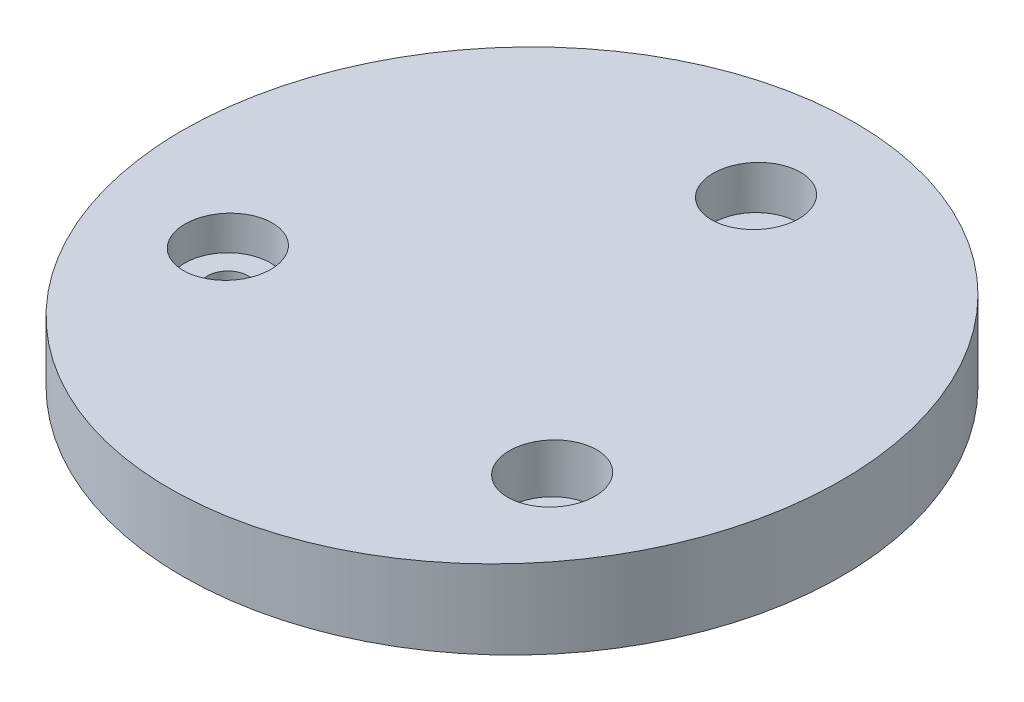
ISO-10303-21;
HEADER;
FILE_DESCRIPTION(('STEP AP214'),'2;1');
FILE_NAME('part.step','',(''),(''),'','','');
FILE_SCHEMA(('AUTOMOTIVE_DESIGN { 1 0 10303 214 1 1 1 1 }'));
ENDSEC;
DATA;
#1=APPLICATION_CONTEXT('core data for automotive mechanical design processes');
#2=APPLICATION_PROTOCOL_DEFINITION('international standard','automotive_design',2000,#1);
#3=PRODUCT_CONTEXT('',#1,'mechanical');
#4=PRODUCT('Part','Part','',(#3));
#5=PRODUCT_RELATED_PRODUCT_CATEGORY('part','',(#4));
#6=PRODUCT_DEFINITION_FORMATION('','',#4);
#7=PRODUCT_DEFINITION_CONTEXT('part definition',#1,'design');
#8=PRODUCT_DEFINITION('design','',#6,#7);
#9=PRODUCT_DEFINITION_SHAPE('','',#8);
#10=(LENGTH_UNIT() NAMED_UNIT(*) SI_UNIT(.MILLI.,.METRE.));
#11=(NAMED_UNIT(*) PLANE_ANGLE_UNIT() SI_UNIT($,.RADIAN.));
#12=(NAMED_UNIT(*) SI_UNIT($,.STERADIAN.) SOLID_ANGLE_UNIT());
#13=UNCERTAINTY_MEASURE_WITH_UNIT(LENGTH_MEASURE(1.E-05),#10,'distance_accuracy_value','');
#14=(GEOMETRIC_REPRESENTATION_CONTEXT(3) GLOBAL_UNCERTAINTY_ASSIGNED_CONTEXT((#13)) GLOBAL_UNIT_ASSIGNED_CONTEXT((#10,
#11,#12)) REPRESENTATION_CONTEXT('',''));
#15=CARTESIAN_POINT('',(0.,0.,0.));
#16=DIRECTION('',(0.,0.,1.));
#17=DIRECTION('',(1.,0.,0.));
#18=AXIS2_PLACEMENT_3D('',#15,#16,#17);
#19=CARTESIAN_POINT('',(0.,4.3,0.));
#20=DIRECTION('',(0.,-1.,0.));
#21=DIRECTION('',(0.,0.,-1.));
#22=AXIS2_PLACEMENT_3D('',#19,#20,#21);
#23=CYLINDRICAL_SURFACE('',#22,25.);
#24=CARTESIAN_POINT('',(0.,5.3,0.));
#25=DIRECTION('',(0.0399680383488716,-0.999200958721789,0.));
#26=DIRECTION('',(-0.99920095872179,-0.0399680383488716,0.));
#27=AXIS2_PLACEMENT_3D('',#24,#25,#26);
#28=ELLIPSE('',#27,25.0199920063936,25.);
#29=CARTESIAN_POINT('',(-25.,4.3,0.));
#30=VERTEX_POINT('',#29);
#31=EDGE_CURVE('E33',#30,#30,#28,.F.);
#32=ORIENTED_EDGE('',*,*,#31,.F.);
#33=EDGE_LOOP('',(#32));
#34=FACE_BOUND('',#33,.T.);
#35=CARTESIAN_POINT('',(0.,0.,0.));
#36=DIRECTION('',(0.,1.,0.));
#37=DIRECTION('',(0.,0.,1.));
#38=AXIS2_PLACEMENT_3D('',#35,#36,#37);
#39=CIRCLE('',#38,25.);
#40=CARTESIAN_POINT('',(0.,0.,25.));
#41=VERTEX_POINT('',#40);
#42=EDGE_CURVE('E10',#41,#41,#39,.T.);
#43=ORIENTED_EDGE('',*,*,#42,.T.);
#44=EDGE_LOOP('',(#43));
#45=FACE_BOUND('',#44,.T.);
#46=ADVANCED_FACE('F30',(#34,#45),#23,.T.);
#47=CARTESIAN_POINT('',(0.,0.,0.));
#48=DIRECTION('',(0.,1.,0.));
#49=DIRECTION('',(0.,0.,1.));
#50=AXIS2_PLACEMENT_3D('',#47,#48,#49);
#51=PLANE('',#50);
#52=CARTESIAN_POINT('',(2.15368217163082,0.,-16.3588402126679));
#53=DIRECTION('',(0.,1.,0.));
#54=DIRECTION('',(0.,0.,1.));
#55=AXIS2_PLACEMENT_3D('',#52,#53,#54);
#56=CIRCLE('',#55,1.55);
#57=CARTESIAN_POINT('',(2.15368217163082,0.,-14.8088402126679));
#58=VERTEX_POINT('',#57);
#59=EDGE_CURVE('E44',#58,#58,#56,.T.);
#60=ORIENTED_EDGE('',*,*,#59,.T.);
#61=EDGE_LOOP('',(#60));
#62=FACE_BOUND('',#61,.T.);
#63=CARTESIAN_POINT('',(13.0903301148054,0.,10.0445635786439));
#64=DIRECTION('',(0.,1.,0.));
#65=DIRECTION('',(0.,0.,1.));
#66=AXIS2_PLACEMENT_3D('',#63,#64,#65);
#67=CIRCLE('',#66,1.55);
#68=CARTESIAN_POINT('',(13.0903301148054,0.,11.5945635786439));
#69=VERTEX_POINT('',#68);
#70=EDGE_CURVE('E45',#69,#69,#67,.T.);
#71=ORIENTED_EDGE('',*,*,#70,.T.);
#72=EDGE_LOOP('',(#71));
#73=FACE_BOUND('',#72,.T.);
#74=CARTESIAN_POINT('',(-15.2440122864362,0.,6.314276634024));
#75=DIRECTION('',(0.,1.,0.));
#76=DIRECTION('',(0.,0.,1.));
#77=AXIS2_PLACEMENT_3D('',#74,#75,#76);
#78=CIRCLE('',#77,1.55);
#79=CARTESIAN_POINT('',(-15.2440122864362,0.,7.86427663402399));
#80=VERTEX_POINT('',#79);
#81=EDGE_CURVE('E40',#80,#80,#78,.T.);
#82=ORIENTED_EDGE('',*,*,#81,.T.);
#83=EDGE_LOOP('',(#82));
#84=FACE_BOUND('',#83,.T.);
#85=ORIENTED_EDGE('',*,*,#42,.F.);
#86=EDGE_LOOP('',(#85));
#87=FACE_BOUND('',#86,.T.);
#88=ADVANCED_FACE('F92',(#62,#73,#84,#87),#51,.F.);
#89=CARTESIAN_POINT('',(-25.,4.3,25.001));
#90=DIRECTION('',(0.0399680383488716,-0.999200958721789,0.));
#91=DIRECTION('',(0.99920095872179,0.0399680383488716,0.));
#92=AXIS2_PLACEMENT_3D('',#89,#90,#91);
#93=PLANE('',#92);
#94=CARTESIAN_POINT('',(-15.2440122864362,4.69023950854255,6.314276634024));
#95=DIRECTION('',(0.0399680383488716,-0.999200958721789,0.));
#96=DIRECTION('',(-0.99920095872179,-0.0399680383488716,0.));
#97=AXIS2_PLACEMENT_3D('',#94,#95,#96);
#98=ELLIPSE('',#97,3.25259896083117,3.25);
#99=CARTESIAN_POINT('',(-18.4940122864362,4.56023950854255,6.314276634024));
#100=VERTEX_POINT('',#99);
#101=EDGE_CURVE('E57',#100,#100,#98,.F.);
#102=ORIENTED_EDGE('',*,*,#101,.F.);
#103=EDGE_LOOP('',(#102));
#104=FACE_BOUND('',#103,.T.);
#105=CARTESIAN_POINT('',(13.0903301148054,5.82361320459222,10.0445635786439));
#106=DIRECTION('',(0.0399680383488716,-0.999200958721789,0.));
#107=DIRECTION('',(-0.99920095872179,-0.0399680383488716,0.));
#108=AXIS2_PLACEMENT_3D('',#105,#106,#107);
#109=ELLIPSE('',#108,3.25259896083117,3.25);
#110=CARTESIAN_POINT('',(9.84033011480539,5.69361320459222,10.0445635786439));
#111=VERTEX_POINT('',#110);
#112=EDGE_CURVE('E60',#111,#111,#109,.F.);
#113=ORIENTED_EDGE('',*,*,#112,.F.);
#114=EDGE_LOOP('',(#113));
#115=FACE_BOUND('',#114,.T.);
#116=CARTESIAN_POINT('',(2.15368217163082,5.38614728686523,-16.3588402126679));
#117=DIRECTION('',(0.0399680383488716,-0.999200958721789,0.));
#118=DIRECTION('',(-0.99920095872179,-0.0399680383488716,0.));
#119=AXIS2_PLACEMENT_3D('',#116,#117,#118);
#120=ELLIPSE('',#119,3.25259896083117,3.25);
#121=CARTESIAN_POINT('',(-1.09631782836918,5.25614728686523,-16.3588402126679));
#122=VERTEX_POINT('',#121);
#123=EDGE_CURVE('E48',#122,#122,#120,.F.);
#124=ORIENTED_EDGE('',*,*,#123,.F.);
#125=EDGE_LOOP('',(#124));
#126=FACE_BOUND('',#125,.T.);
#127=ORIENTED_EDGE('',*,*,#31,.T.);
#128=EDGE_LOOP('',(#127));
#129=FACE_BOUND('',#128,.T.);
#130=ADVANCED_FACE('F97',(#104,#115,#126,#129),#93,.F.);
#131=CARTESIAN_POINT('',(-15.2440122864362,6.301,6.314276634024));
#132=DIRECTION('',(0.,-1.,0.));
#133=DIRECTION('',(0.,0.,-1.));
#134=AXIS2_PLACEMENT_3D('',#131,#132,#133);
#135=CYLINDRICAL_SURFACE('',#134,1.55);
#136=CARTESIAN_POINT('',(-15.2440122864362,2.,6.314276634024));
#137=DIRECTION('',(0.,-1.,0.));
#138=DIRECTION('',(0.,0.,-1.));
#139=AXIS2_PLACEMENT_3D('',#136,#137,#138);
#140=CIRCLE('',#139,1.55);
#141=CARTESIAN_POINT('',(-15.2440122864362,2.,4.76427663402399));
#142=VERTEX_POINT('',#141);
#143=EDGE_CURVE('E63',#142,#142,#140,.F.);
#144=ORIENTED_EDGE('',*,*,#143,.T.);
#145=EDGE_LOOP('',(#144));
#146=FACE_BOUND('',#145,.T.);
#147=ORIENTED_EDGE('',*,*,#81,.F.);
#148=EDGE_LOOP('',(#147));
#149=FACE_BOUND('',#148,.T.);
#150=ADVANCED_FACE('F102',(#146,#149),#135,.F.);
#151=CARTESIAN_POINT('',(13.0903301148054,6.301,10.0445635786439));
#152=DIRECTION('',(0.,-1.,0.));
#153=DIRECTION('',(0.,0.,-1.));
#154=AXIS2_PLACEMENT_3D('',#151,#152,#153);
#155=CYLINDRICAL_SURFACE('',#154,1.55);
#156=CARTESIAN_POINT('',(13.0903301148054,2.,10.0445635786439));
#157=DIRECTION('',(0.,-1.,0.));
#158=DIRECTION('',(0.,0.,-1.));
#159=AXIS2_PLACEMENT_3D('',#156,#157,#158);
#160=CIRCLE('',#159,1.55);
#161=CARTESIAN_POINT('',(13.0903301148054,2.,8.49456357864388));
#162=VERTEX_POINT('',#161);
#163=EDGE_CURVE('E65',#162,#162,#160,.F.);
#164=ORIENTED_EDGE('',*,*,#163,.T.);
#165=EDGE_LOOP('',(#164));
#166=FACE_BOUND('',#165,.T.);
#167=ORIENTED_EDGE('',*,*,#70,.F.);
#168=EDGE_LOOP('',(#167));
#169=FACE_BOUND('',#168,.T.);
#170=ADVANCED_FACE('F108',(#166,#169),#155,.F.);
#171=CARTESIAN_POINT('',(2.15368217163082,6.301,-16.3588402126679));
#172=DIRECTION('',(0.,-1.,0.));
#173=DIRECTION('',(0.,0.,-1.));
#174=AXIS2_PLACEMENT_3D('',#171,#172,#173);
#175=CYLINDRICAL_SURFACE('',#174,1.55);
#176=CARTESIAN_POINT('',(2.15368217163082,2.,-16.3588402126679));
#177=DIRECTION('',(0.,-1.,0.));
#178=DIRECTION('',(0.,0.,-1.));
#179=AXIS2_PLACEMENT_3D('',#176,#177,#178);
#180=CIRCLE('',#179,1.55);
#181=CARTESIAN_POINT('',(2.15368217163082,2.,-17.9088402126679));
#182=VERTEX_POINT('',#181);
#183=EDGE_CURVE('E54',#182,#182,#180,.F.);
#184=ORIENTED_EDGE('',*,*,#183,.T.);
#185=EDGE_LOOP('',(#184));
#186=FACE_BOUND('',#185,.T.);
#187=ORIENTED_EDGE('',*,*,#59,.F.);
#188=EDGE_LOOP('',(#187));
#189=FACE_BOUND('',#188,.T.);
#190=ADVANCED_FACE('F116',(#186,#189),#175,.F.);
#191=CARTESIAN_POINT('',(2.15368217163082,6.301,-16.3588402126679));
#192=DIRECTION('',(0.,-1.,0.));
#193=DIRECTION('',(0.,0.,-1.));
#194=AXIS2_PLACEMENT_3D('',#191,#192,#193);
#195=CYLINDRICAL_SURFACE('',#194,3.25);
#196=CARTESIAN_POINT('',(2.15368217163082,2.,-16.3588402126679));
#197=DIRECTION('',(0.,-1.,0.));
#198=DIRECTION('',(0.,0.,-1.));
#199=AXIS2_PLACEMENT_3D('',#196,#197,#198);
#200=CIRCLE('',#199,3.25);
#201=CARTESIAN_POINT('',(2.15368217163082,2.,-19.6088402126679));
#202=VERTEX_POINT('',#201);
#203=EDGE_CURVE('E53',#202,#202,#200,.T.);
#204=ORIENTED_EDGE('',*,*,#203,.T.);
#205=EDGE_LOOP('',(#204));
#206=FACE_BOUND('',#205,.T.);
#207=ORIENTED_EDGE('',*,*,#123,.T.);
#208=EDGE_LOOP('',(#207));
#209=FACE_BOUND('',#208,.T.);
#210=ADVANCED_FACE('F120',(#206,#209),#195,.F.);
#211=CARTESIAN_POINT('',(2.15368217163082,2.,-16.3588402126679));
#212=DIRECTION('',(0.,-1.,0.));
#213=DIRECTION('',(0.,0.,-1.));
#214=AXIS2_PLACEMENT_3D('',#211,#212,#213);
#215=PLANE('',#214);
#216=ORIENTED_EDGE('',*,*,#183,.F.);
#217=EDGE_LOOP('',(#216));
#218=FACE_BOUND('',#217,.T.);
#219=ORIENTED_EDGE('',*,*,#203,.F.);
#220=EDGE_LOOP('',(#219));
#221=FACE_BOUND('',#220,.T.);
#222=ADVANCED_FACE('F124',(#218,#221),#215,.F.);
#223=CARTESIAN_POINT('',(13.0903301148054,6.301,10.0445635786439));
#224=DIRECTION('',(0.,-1.,0.));
#225=DIRECTION('',(0.,0.,-1.));
#226=AXIS2_PLACEMENT_3D('',#223,#224,#225);
#227=CYLINDRICAL_SURFACE('',#226,3.25);
#228=CARTESIAN_POINT('',(13.0903301148054,2.,10.0445635786439));
#229=DIRECTION('',(0.,-1.,0.));
#230=DIRECTION('',(0.,0.,-1.));
#231=AXIS2_PLACEMENT_3D('',#228,#229,#230);
#232=CIRCLE('',#231,3.25);
#233=CARTESIAN_POINT('',(13.0903301148054,2.,6.79456357864388));
#234=VERTEX_POINT('',#233);
#235=EDGE_CURVE('E64',#234,#234,#232,.T.);
#236=ORIENTED_EDGE('',*,*,#235,.T.);
#237=EDGE_LOOP('',(#236));
#238=FACE_BOUND('',#237,.T.);
#239=ORIENTED_EDGE('',*,*,#112,.T.);
#240=EDGE_LOOP('',(#239));
#241=FACE_BOUND('',#240,.T.);
#242=ADVANCED_FACE('F128',(#238,#241),#227,.F.);
#243=CARTESIAN_POINT('',(13.0903301148054,2.,10.0445635786439));
#244=DIRECTION('',(0.,-1.,0.));
#245=DIRECTION('',(0.,0.,-1.));
#246=AXIS2_PLACEMENT_3D('',#243,#244,#245);
#247=PLANE('',#246);
#248=ORIENTED_EDGE('',*,*,#163,.F.);
#249=EDGE_LOOP('',(#248));
#250=FACE_BOUND('',#249,.T.);
#251=ORIENTED_EDGE('',*,*,#235,.F.);
#252=EDGE_LOOP('',(#251));
#253=FACE_BOUND('',#252,.T.);
#254=ADVANCED_FACE('F88',(#250,#253),#247,.F.);
#255=CARTESIAN_POINT('',(-15.2440122864362,6.301,6.314276634024));
#256=DIRECTION('',(0.,-1.,0.));
#257=DIRECTION('',(0.,0.,-1.));
#258=AXIS2_PLACEMENT_3D('',#255,#256,#257);
#259=CYLINDRICAL_SURFACE('',#258,3.25);
#260=CARTESIAN_POINT('',(-15.2440122864362,2.,6.314276634024));
#261=DIRECTION('',(0.,-1.,0.));
#262=DIRECTION('',(0.,0.,-1.));
#263=AXIS2_PLACEMENT_3D('',#260,#261,#262);
#264=CIRCLE('',#263,3.25);
#265=CARTESIAN_POINT('',(-15.2440122864362,2.,3.06427663402399));
#266=VERTEX_POINT('',#265);
#267=EDGE_CURVE('E72',#266,#266,#264,.T.);
#268=ORIENTED_EDGE('',*,*,#267,.T.);
#269=EDGE_LOOP('',(#268));
#270=FACE_BOUND('',#269,.T.);
#271=ORIENTED_EDGE('',*,*,#101,.T.);
#272=EDGE_LOOP('',(#271));
#273=FACE_BOUND('',#272,.T.);
#274=ADVANCED_FACE('F78',(#270,#273),#259,.F.);
#275=CARTESIAN_POINT('',(-15.2440122864362,2.,6.314276634024));
#276=DIRECTION('',(0.,-1.,0.));
#277=DIRECTION('',(0.,0.,-1.));
#278=AXIS2_PLACEMENT_3D('',#275,#276,#277);
#279=PLANE('',#278);
#280=ORIENTED_EDGE('',*,*,#143,.F.);
#281=EDGE_LOOP('',(#280));
#282=FACE_BOUND('',#281,.T.);
#283=ORIENTED_EDGE('',*,*,#267,.F.);
#284=EDGE_LOOP('',(#283));
#285=FACE_BOUND('',#284,.T.);
#286=ADVANCED_FACE('F81',(#282,#285),#279,.F.);
#287=CLOSED_SHELL('',(#46,#88,#130,#150,#170,#190,#210,#222,#242,#254,#274,#286));
#288=MANIFOLD_SOLID_BREP('B2',#287);
#289=ADVANCED_BREP_SHAPE_REPRESENTATION('',(#18,#288),#14);
#290=SHAPE_DEFINITION_REPRESENTATION(#9,#289);
ENDSEC;
END-ISO-10303-21;
